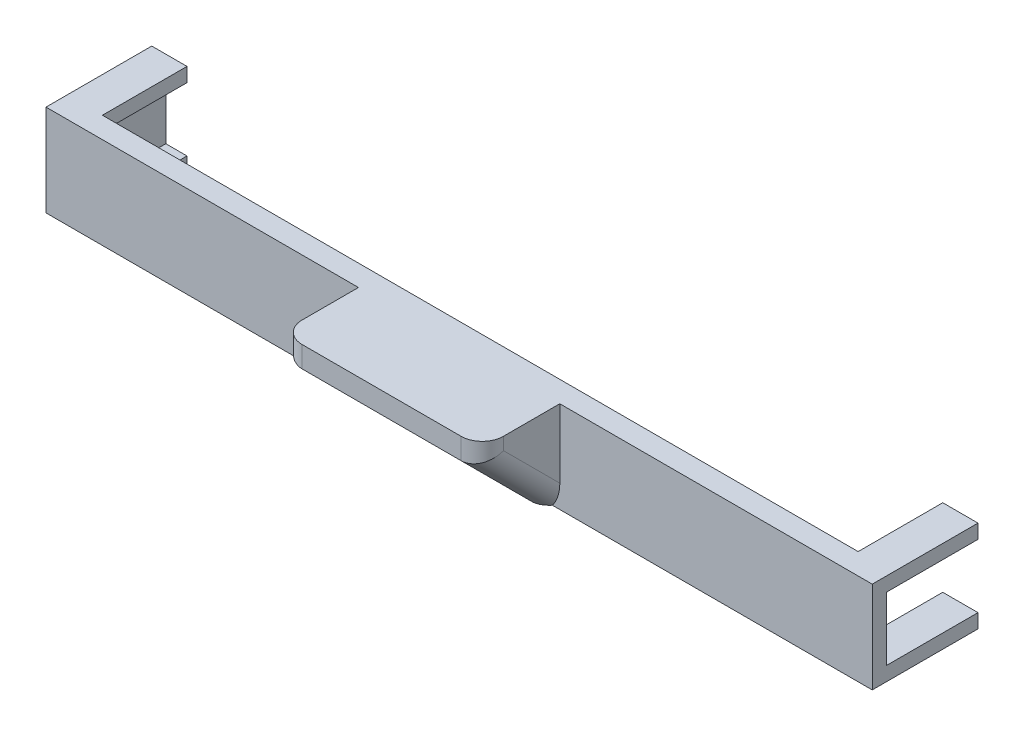
ISO-10303-21;
HEADER;
FILE_DESCRIPTION(('STEP AP214'),'2;1');
FILE_NAME('part.step','',(''),(''),'','','');
FILE_SCHEMA(('AUTOMOTIVE_DESIGN { 1 0 10303 214 1 1 1 1 }'));
ENDSEC;
DATA;
#1=APPLICATION_CONTEXT('core data for automotive mechanical design processes');
#2=APPLICATION_PROTOCOL_DEFINITION('international standard','automotive_design',2000,#1);
#3=PRODUCT_CONTEXT('',#1,'mechanical');
#4=PRODUCT('Part','Part','',(#3));
#5=PRODUCT_RELATED_PRODUCT_CATEGORY('part','',(#4));
#6=PRODUCT_DEFINITION_FORMATION('','',#4);
#7=PRODUCT_DEFINITION_CONTEXT('part definition',#1,'design');
#8=PRODUCT_DEFINITION('design','',#6,#7);
#9=PRODUCT_DEFINITION_SHAPE('','',#8);
#10=(LENGTH_UNIT() NAMED_UNIT(*) SI_UNIT(.MILLI.,.METRE.));
#11=(NAMED_UNIT(*) PLANE_ANGLE_UNIT() SI_UNIT($,.RADIAN.));
#12=(NAMED_UNIT(*) SI_UNIT($,.STERADIAN.) SOLID_ANGLE_UNIT());
#13=UNCERTAINTY_MEASURE_WITH_UNIT(LENGTH_MEASURE(1.E-05),#10,'distance_accuracy_value','');
#14=(GEOMETRIC_REPRESENTATION_CONTEXT(3) GLOBAL_UNCERTAINTY_ASSIGNED_CONTEXT((#13)) GLOBAL_UNIT_ASSIGNED_CONTEXT((#10,
#11,#12)) REPRESENTATION_CONTEXT('',''));
#15=CARTESIAN_POINT('',(0.,0.,0.));
#16=DIRECTION('',(0.,0.,1.));
#17=DIRECTION('',(1.,0.,0.));
#18=AXIS2_PLACEMENT_3D('',#15,#16,#17);
#19=CARTESIAN_POINT('',(0.,0.,15.));
#20=DIRECTION('',(0.,0.,1.));
#21=DIRECTION('',(1.,0.,0.));
#22=AXIS2_PLACEMENT_3D('',#19,#20,#21);
#23=PLANE('',#22);
#24=DIRECTION('',(0.,-1.,0.));
#25=VECTOR('',#24,1.);
#26=CARTESIAN_POINT('',(-26.3344427299537,-24.497494349856,15.));
#27=LINE('',#26,#25);
#28=CARTESIAN_POINT('',(-26.3344427299537,-24.497494349856,15.));
#29=VERTEX_POINT('',#28);
#30=CARTESIAN_POINT('',(-26.3344427299537,-34.2548536627366,15.));
#31=VERTEX_POINT('',#30);
#32=EDGE_CURVE('E204',#29,#31,#27,.T.);
#33=ORIENTED_EDGE('',*,*,#32,.F.);
#34=DIRECTION('',(-1.,0.,0.));
#35=VECTOR('',#34,1.);
#36=CARTESIAN_POINT('',(-70.6544427299537,-24.497494349856,15.));
#37=LINE('',#36,#35);
#38=CARTESIAN_POINT('',(-70.6544427299537,-24.497494349856,15.));
#39=VERTEX_POINT('',#38);
#40=EDGE_CURVE('E221',#29,#39,#37,.T.);
#41=ORIENTED_EDGE('',*,*,#40,.T.);
#42=DIRECTION('',(0.,-1.,0.));
#43=VECTOR('',#42,1.);
#44=CARTESIAN_POINT('',(-70.6544427299537,-24.497494349856,15.));
#45=LINE('',#44,#43);
#46=CARTESIAN_POINT('',(-70.6544427299537,-37.497494349856,15.));
#47=VERTEX_POINT('',#46);
#48=EDGE_CURVE('E251',#39,#47,#45,.T.);
#49=ORIENTED_EDGE('',*,*,#48,.T.);
#50=DIRECTION('',(1.,0.,0.));
#51=VECTOR('',#50,1.);
#52=CARTESIAN_POINT('',(-70.6544427299537,-37.497494349856,15.));
#53=LINE('',#52,#51);
#54=CARTESIAN_POINT('',(-25.2690333034651,-37.497494349856,15.));
#55=VERTEX_POINT('',#54);
#56=EDGE_CURVE('E262',#47,#55,#53,.T.);
#57=ORIENTED_EDGE('',*,*,#56,.T.);
#58=CARTESIAN_POINT('',(-23.3344427299537,-34.2548536627367,15.));
#59=DIRECTION('',(0.,0.,1.));
#60=DIRECTION('',(0.,-1.,0.));
#61=AXIS2_PLACEMENT_3D('',#58,#59,#60);
#62=ELLIPSE('',#61,4.24264068711928,3.);
#63=EDGE_CURVE('E372',#55,#31,#62,.F.);
#64=ORIENTED_EDGE('',*,*,#63,.T.);
#65=EDGE_LOOP('',(#33,#41,#49,#57,#64));
#66=FACE_BOUND('',#65,.T.);
#67=ADVANCED_FACE('F33',(#66),#23,.T.);
#68=CARTESIAN_POINT('',(0.,0.,0.));
#69=DIRECTION('',(0.,0.,1.));
#70=DIRECTION('',(1.,0.,0.));
#71=AXIS2_PLACEMENT_3D('',#68,#69,#70);
#72=PLANE('',#71);
#73=DIRECTION('',(1.,0.,0.));
#74=VECTOR('',#73,1.);
#75=CARTESIAN_POINT('',(-68.6544427299537,-35.497494349856,0.));
#76=LINE('',#75,#74);
#77=CARTESIAN_POINT('',(41.5455572700463,-35.497494349856,0.));
#78=VERTEX_POINT('',#77);
#79=CARTESIAN_POINT('',(46.5455572700463,-35.497494349856,0.));
#80=VERTEX_POINT('',#79);
#81=EDGE_CURVE('E279',#78,#80,#76,.T.);
#82=ORIENTED_EDGE('',*,*,#81,.T.);
#83=DIRECTION('',(0.,1.,0.));
#84=VECTOR('',#83,1.);
#85=CARTESIAN_POINT('',(46.5455572700463,-24.497494349856,0.));
#86=LINE('',#85,#84);
#87=CARTESIAN_POINT('',(46.5455572700463,-37.497494349856,0.));
#88=VERTEX_POINT('',#87);
#89=EDGE_CURVE('E245',#88,#80,#86,.T.);
#90=ORIENTED_EDGE('',*,*,#89,.F.);
#91=DIRECTION('',(1.,0.,0.));
#92=VECTOR('',#91,1.);
#93=CARTESIAN_POINT('',(-70.6544427299537,-37.497494349856,0.));
#94=LINE('',#93,#92);
#95=CARTESIAN_POINT('',(41.5455572700463,-37.497494349856,0.));
#96=VERTEX_POINT('',#95);
#97=EDGE_CURVE('E239',#96,#88,#94,.T.);
#98=ORIENTED_EDGE('',*,*,#97,.F.);
#99=DIRECTION('',(0.,-1.,0.));
#100=VECTOR('',#99,1.);
#101=CARTESIAN_POINT('',(41.5455572700463,-24.497494349856,0.));
#102=LINE('',#101,#100);
#103=EDGE_CURVE('E304',#78,#96,#102,.T.);
#104=ORIENTED_EDGE('',*,*,#103,.F.);
#105=EDGE_LOOP('',(#82,#90,#98,#104));
#106=FACE_BOUND('',#105,.T.);
#107=ADVANCED_FACE('F424',(#106),#72,.F.);
#108=DIRECTION('',(-1.,0.,0.));
#109=VECTOR('',#108,1.);
#110=CARTESIAN_POINT('',(-70.6544427299537,-24.497494349856,0.));
#111=LINE('',#110,#109);
#112=CARTESIAN_POINT('',(-65.6544427299537,-24.497494349856,0.));
#113=VERTEX_POINT('',#112);
#114=CARTESIAN_POINT('',(-70.6544427299537,-24.497494349856,0.));
#115=VERTEX_POINT('',#114);
#116=EDGE_CURVE('E248',#113,#115,#111,.T.);
#117=ORIENTED_EDGE('',*,*,#116,.F.);
#118=DIRECTION('',(0.,-1.,0.));
#119=VECTOR('',#118,1.);
#120=CARTESIAN_POINT('',(-65.6544427299537,-24.497494349856,0.));
#121=LINE('',#120,#119);
#122=CARTESIAN_POINT('',(-65.6544427299537,-26.497494349856,0.));
#123=VERTEX_POINT('',#122);
#124=EDGE_CURVE('E301',#113,#123,#121,.T.);
#125=ORIENTED_EDGE('',*,*,#124,.T.);
#126=DIRECTION('',(-1.,0.,0.));
#127=VECTOR('',#126,1.);
#128=CARTESIAN_POINT('',(-68.6544427299537,-26.497494349856,0.));
#129=LINE('',#128,#127);
#130=CARTESIAN_POINT('',(-68.6544427299537,-26.497494349856,0.));
#131=VERTEX_POINT('',#130);
#132=EDGE_CURVE('E275',#123,#131,#129,.T.);
#133=ORIENTED_EDGE('',*,*,#132,.T.);
#134=DIRECTION('',(0.,-1.,0.));
#135=VECTOR('',#134,1.);
#136=CARTESIAN_POINT('',(-68.6544427299537,-26.497494349856,0.));
#137=LINE('',#136,#135);
#138=CARTESIAN_POINT('',(-68.6544427299537,-35.497494349856,0.));
#139=VERTEX_POINT('',#138);
#140=EDGE_CURVE('E280',#131,#139,#137,.T.);
#141=ORIENTED_EDGE('',*,*,#140,.T.);
#142=CARTESIAN_POINT('',(-65.6544427299537,-35.497494349856,0.));
#143=VERTEX_POINT('',#142);
#144=EDGE_CURVE('E276',#139,#143,#76,.T.);
#145=ORIENTED_EDGE('',*,*,#144,.T.);
#146=CARTESIAN_POINT('',(-65.6544427299537,-37.497494349856,0.));
#147=VERTEX_POINT('',#146);
#148=EDGE_CURVE('E305',#143,#147,#121,.T.);
#149=ORIENTED_EDGE('',*,*,#148,.T.);
#150=CARTESIAN_POINT('',(-70.6544427299537,-37.497494349856,0.));
#151=VERTEX_POINT('',#150);
#152=EDGE_CURVE('E241',#151,#147,#94,.T.);
#153=ORIENTED_EDGE('',*,*,#152,.F.);
#154=DIRECTION('',(0.,-1.,0.));
#155=VECTOR('',#154,1.);
#156=CARTESIAN_POINT('',(-70.6544427299537,-24.497494349856,0.));
#157=LINE('',#156,#155);
#158=EDGE_CURVE('E235',#115,#151,#157,.T.);
#159=ORIENTED_EDGE('',*,*,#158,.F.);
#160=EDGE_LOOP('',(#117,#125,#133,#141,#145,#149,#153,#159));
#161=FACE_BOUND('',#160,.T.);
#162=ADVANCED_FACE('F431',(#161),#72,.F.);
#163=CARTESIAN_POINT('',(-68.6544427299537,-26.497494349856,15.));
#164=DIRECTION('',(1.,0.,0.));
#165=DIRECTION('',(0.,0.,-1.));
#166=AXIS2_PLACEMENT_3D('',#163,#164,#165);
#167=PLANE('',#166);
#168=DIRECTION('',(0.,0.,-1.));
#169=VECTOR('',#168,1.);
#170=CARTESIAN_POINT('',(-68.6544427299537,-26.497494349856,15.));
#171=LINE('',#170,#169);
#172=CARTESIAN_POINT('',(-68.6544427299537,-26.497494349856,13.));
#173=VERTEX_POINT('',#172);
#174=EDGE_CURVE('E269',#173,#131,#171,.T.);
#175=ORIENTED_EDGE('',*,*,#174,.F.);
#176=DIRECTION('',(0.,-1.,0.));
#177=VECTOR('',#176,1.);
#178=CARTESIAN_POINT('',(-68.6544427299537,-26.497494349856,13.));
#179=LINE('',#178,#177);
#180=CARTESIAN_POINT('',(-68.6544427299537,-35.497494349856,13.));
#181=VERTEX_POINT('',#180);
#182=EDGE_CURVE('E283',#173,#181,#179,.T.);
#183=ORIENTED_EDGE('',*,*,#182,.T.);
#184=DIRECTION('',(0.,0.,-1.));
#185=VECTOR('',#184,1.);
#186=CARTESIAN_POINT('',(-68.6544427299537,-35.497494349856,15.));
#187=LINE('',#186,#185);
#188=EDGE_CURVE('E240',#181,#139,#187,.T.);
#189=ORIENTED_EDGE('',*,*,#188,.T.);
#190=ORIENTED_EDGE('',*,*,#140,.F.);
#191=EDGE_LOOP('',(#175,#183,#189,#190));
#192=FACE_BOUND('',#191,.T.);
#193=ADVANCED_FACE('F451',(#192),#167,.T.);
#194=CARTESIAN_POINT('',(-68.6544427299537,-35.497494349856,15.));
#195=DIRECTION('',(0.,1.,0.));
#196=DIRECTION('',(0.,0.,1.));
#197=AXIS2_PLACEMENT_3D('',#194,#195,#196);
#198=PLANE('',#197);
#199=DIRECTION('',(0.,0.,1.));
#200=VECTOR('',#199,1.);
#201=CARTESIAN_POINT('',(-65.6544427299537,-35.497494349856,15.));
#202=LINE('',#201,#200);
#203=CARTESIAN_POINT('',(-65.6544427299537,-35.497494349856,12.));
#204=VERTEX_POINT('',#203);
#205=EDGE_CURVE('E288',#143,#204,#202,.T.);
#206=ORIENTED_EDGE('',*,*,#205,.F.);
#207=ORIENTED_EDGE('',*,*,#144,.F.);
#208=ORIENTED_EDGE('',*,*,#188,.F.);
#209=DIRECTION('',(1.,0.,0.));
#210=VECTOR('',#209,1.);
#211=CARTESIAN_POINT('',(-68.6544427299537,-35.497494349856,13.));
#212=LINE('',#211,#210);
#213=CARTESIAN_POINT('',(46.5455572700463,-35.497494349856,13.));
#214=VERTEX_POINT('',#213);
#215=EDGE_CURVE('E286',#181,#214,#212,.T.);
#216=ORIENTED_EDGE('',*,*,#215,.T.);
#217=DIRECTION('',(0.,0.,-1.));
#218=VECTOR('',#217,1.);
#219=CARTESIAN_POINT('',(46.5455572700463,-35.497494349856,0.));
#220=LINE('',#219,#218);
#221=EDGE_CURVE('E324',#214,#80,#220,.T.);
#222=ORIENTED_EDGE('',*,*,#221,.T.);
#223=ORIENTED_EDGE('',*,*,#81,.F.);
#224=DIRECTION('',(0.,0.,-1.));
#225=VECTOR('',#224,1.);
#226=CARTESIAN_POINT('',(41.5455572700463,-35.497494349856,15.));
#227=LINE('',#226,#225);
#228=CARTESIAN_POINT('',(41.5455572700463,-35.497494349856,12.));
#229=VERTEX_POINT('',#228);
#230=EDGE_CURVE('E296',#229,#78,#227,.T.);
#231=ORIENTED_EDGE('',*,*,#230,.F.);
#232=DIRECTION('',(1.,0.,0.));
#233=VECTOR('',#232,1.);
#234=CARTESIAN_POINT('',(-68.6544427299537,-35.497494349856,12.));
#235=LINE('',#234,#233);
#236=EDGE_CURVE('E292',#204,#229,#235,.T.);
#237=ORIENTED_EDGE('',*,*,#236,.F.);
#238=EDGE_LOOP('',(#206,#207,#208,#216,#222,#223,#231,#237));
#239=FACE_BOUND('',#238,.T.);
#240=ADVANCED_FACE('F445',(#239),#198,.T.);
#241=CARTESIAN_POINT('',(-68.6544427299537,-26.497494349856,15.));
#242=DIRECTION('',(0.,-1.,0.));
#243=DIRECTION('',(0.,0.,-1.));
#244=AXIS2_PLACEMENT_3D('',#241,#242,#243);
#245=PLANE('',#244);
#246=DIRECTION('',(0.,0.,-1.));
#247=VECTOR('',#246,1.);
#248=CARTESIAN_POINT('',(-65.6544427299537,-26.497494349856,15.));
#249=LINE('',#248,#247);
#250=CARTESIAN_POINT('',(-65.6544427299537,-26.497494349856,12.));
#251=VERTEX_POINT('',#250);
#252=EDGE_CURVE('E290',#251,#123,#249,.T.);
#253=ORIENTED_EDGE('',*,*,#252,.F.);
#254=DIRECTION('',(-1.,0.,0.));
#255=VECTOR('',#254,1.);
#256=CARTESIAN_POINT('',(-68.6544427299537,-26.497494349856,12.));
#257=LINE('',#256,#255);
#258=CARTESIAN_POINT('',(41.5455572700463,-26.497494349856,12.));
#259=VERTEX_POINT('',#258);
#260=EDGE_CURVE('E294',#259,#251,#257,.T.);
#261=ORIENTED_EDGE('',*,*,#260,.F.);
#262=DIRECTION('',(0.,0.,1.));
#263=VECTOR('',#262,1.);
#264=CARTESIAN_POINT('',(41.5455572700463,-26.497494349856,15.));
#265=LINE('',#264,#263);
#266=CARTESIAN_POINT('',(41.5455572700463,-26.497494349856,0.));
#267=VERTEX_POINT('',#266);
#268=EDGE_CURVE('E298',#267,#259,#265,.T.);
#269=ORIENTED_EDGE('',*,*,#268,.F.);
#270=CARTESIAN_POINT('',(46.5455572700463,-26.497494349856,0.));
#271=VERTEX_POINT('',#270);
#272=EDGE_CURVE('E272',#271,#267,#129,.T.);
#273=ORIENTED_EDGE('',*,*,#272,.F.);
#274=DIRECTION('',(0.,0.,1.));
#275=VECTOR('',#274,1.);
#276=CARTESIAN_POINT('',(46.5455572700463,-26.497494349856,0.));
#277=LINE('',#276,#275);
#278=CARTESIAN_POINT('',(46.5455572700463,-26.497494349856,13.));
#279=VERTEX_POINT('',#278);
#280=EDGE_CURVE('E213',#271,#279,#277,.T.);
#281=ORIENTED_EDGE('',*,*,#280,.T.);
#282=DIRECTION('',(-1.,0.,0.));
#283=VECTOR('',#282,1.);
#284=CARTESIAN_POINT('',(-68.6544427299537,-26.497494349856,13.));
#285=LINE('',#284,#283);
#286=EDGE_CURVE('E259',#279,#173,#285,.T.);
#287=ORIENTED_EDGE('',*,*,#286,.T.);
#288=ORIENTED_EDGE('',*,*,#174,.T.);
#289=ORIENTED_EDGE('',*,*,#132,.F.);
#290=EDGE_LOOP('',(#253,#261,#269,#273,#281,#287,#288,#289));
#291=FACE_BOUND('',#290,.T.);
#292=ADVANCED_FACE('F437',(#291),#245,.T.);
#293=DIRECTION('',(0.,1.,0.));
#294=VECTOR('',#293,1.);
#295=CARTESIAN_POINT('',(2.22555727004627,-24.497494349856,15.));
#296=LINE('',#295,#294);
#297=CARTESIAN_POINT('',(2.22555727004627,-34.2548536627367,15.));
#298=VERTEX_POINT('',#297);
#299=CARTESIAN_POINT('',(2.22555727004627,-24.497494349856,15.));
#300=VERTEX_POINT('',#299);
#301=EDGE_CURVE('E193',#298,#300,#296,.T.);
#302=ORIENTED_EDGE('',*,*,#301,.F.);
#303=CARTESIAN_POINT('',(-0.774442729953734,-34.2548536627367,15.));
#304=DIRECTION('',(0.,0.,1.));
#305=DIRECTION('',(0.,1.,0.));
#306=AXIS2_PLACEMENT_3D('',#303,#304,#305);
#307=ELLIPSE('',#306,4.24264068711928,3.);
#308=CARTESIAN_POINT('',(1.16014784355765,-37.497494349856,15.));
#309=VERTEX_POINT('',#308);
#310=EDGE_CURVE('E11',#298,#309,#307,.F.);
#311=ORIENTED_EDGE('',*,*,#310,.T.);
#312=CARTESIAN_POINT('',(46.5455572700463,-37.497494349856,15.));
#313=VERTEX_POINT('',#312);
#314=EDGE_CURVE('E49',#309,#313,#53,.T.);
#315=ORIENTED_EDGE('',*,*,#314,.T.);
#316=DIRECTION('',(0.,1.,0.));
#317=VECTOR('',#316,1.);
#318=CARTESIAN_POINT('',(46.5455572700463,-24.497494349856,15.));
#319=LINE('',#318,#317);
#320=CARTESIAN_POINT('',(46.5455572700463,-24.497494349856,15.));
#321=VERTEX_POINT('',#320);
#322=EDGE_CURVE('E218',#313,#321,#319,.T.);
#323=ORIENTED_EDGE('',*,*,#322,.T.);
#324=EDGE_CURVE('E211',#321,#300,#37,.T.);
#325=ORIENTED_EDGE('',*,*,#324,.T.);
#326=EDGE_LOOP('',(#302,#311,#315,#323,#325));
#327=FACE_BOUND('',#326,.T.);
#328=ADVANCED_FACE('F216',(#327),#23,.T.);
#329=CARTESIAN_POINT('',(46.5455572700463,-24.497494349856,0.));
#330=VERTEX_POINT('',#329);
#331=EDGE_CURVE('E244',#271,#330,#86,.T.);
#332=ORIENTED_EDGE('',*,*,#331,.F.);
#333=ORIENTED_EDGE('',*,*,#272,.T.);
#334=CARTESIAN_POINT('',(41.5455572700463,-24.497494349856,0.));
#335=VERTEX_POINT('',#334);
#336=EDGE_CURVE('E306',#335,#267,#102,.T.);
#337=ORIENTED_EDGE('',*,*,#336,.F.);
#338=EDGE_CURVE('E249',#330,#335,#111,.T.);
#339=ORIENTED_EDGE('',*,*,#338,.F.);
#340=EDGE_LOOP('',(#332,#333,#337,#339));
#341=FACE_BOUND('',#340,.T.);
#342=ADVANCED_FACE('F434',(#341),#72,.F.);
#343=CARTESIAN_POINT('',(-70.6544427299537,-24.497494349856,15.));
#344=DIRECTION('',(1.,0.,0.));
#345=DIRECTION('',(0.,1.,0.));
#346=AXIS2_PLACEMENT_3D('',#343,#344,#345);
#347=PLANE('',#346);
#348=DIRECTION('',(0.,0.,-1.));
#349=VECTOR('',#348,1.);
#350=CARTESIAN_POINT('',(-70.6544427299537,-24.497494349856,15.));
#351=LINE('',#350,#349);
#352=EDGE_CURVE('E220',#39,#115,#351,.T.);
#353=ORIENTED_EDGE('',*,*,#352,.T.);
#354=ORIENTED_EDGE('',*,*,#158,.T.);
#355=DIRECTION('',(0.,0.,-1.));
#356=VECTOR('',#355,1.);
#357=CARTESIAN_POINT('',(-70.6544427299537,-37.497494349856,15.));
#358=LINE('',#357,#356);
#359=EDGE_CURVE('E257',#47,#151,#358,.T.);
#360=ORIENTED_EDGE('',*,*,#359,.F.);
#361=ORIENTED_EDGE('',*,*,#48,.F.);
#362=EDGE_LOOP('',(#353,#354,#360,#361));
#363=FACE_BOUND('',#362,.T.);
#364=ADVANCED_FACE('F442',(#363),#347,.F.);
#365=CARTESIAN_POINT('',(-70.6544427299537,-37.497494349856,15.));
#366=DIRECTION('',(0.,1.,0.));
#367=DIRECTION('',(0.,0.,1.));
#368=AXIS2_PLACEMENT_3D('',#365,#366,#367);
#369=PLANE('',#368);
#370=ORIENTED_EDGE('',*,*,#314,.F.);
#371=CARTESIAN_POINT('',(-0.774442729953734,-37.497494349856,11.7573593128807));
#372=DIRECTION('',(0.,1.,0.));
#373=DIRECTION('',(0.,0.,1.));
#374=AXIS2_PLACEMENT_3D('',#371,#372,#373);
#375=ELLIPSE('',#374,4.24264068711929,3.);
#376=CARTESIAN_POINT('',(-0.774442729953733,-37.497494349856,15.9999999999999));
#377=VERTEX_POINT('',#376);
#378=EDGE_CURVE('E53',#309,#377,#375,.F.);
#379=ORIENTED_EDGE('',*,*,#378,.T.);
#380=DIRECTION('',(-1.,0.,0.));
#381=VECTOR('',#380,1.);
#382=CARTESIAN_POINT('',(-26.3344427299537,-37.497494349856,15.9999999999999));
#383=LINE('',#382,#381);
#384=CARTESIAN_POINT('',(-23.3344427299537,-37.497494349856,15.9999999999999));
#385=VERTEX_POINT('',#384);
#386=EDGE_CURVE('E356',#377,#385,#383,.T.);
#387=ORIENTED_EDGE('',*,*,#386,.T.);
#388=CARTESIAN_POINT('',(-23.3344427299537,-37.497494349856,11.7573593128807));
#389=DIRECTION('',(0.,1.,0.));
#390=DIRECTION('',(0.,0.,-1.));
#391=AXIS2_PLACEMENT_3D('',#388,#389,#390);
#392=ELLIPSE('',#391,4.24264068711929,3.);
#393=EDGE_CURVE('E374',#385,#55,#392,.F.);
#394=ORIENTED_EDGE('',*,*,#393,.T.);
#395=ORIENTED_EDGE('',*,*,#56,.F.);
#396=ORIENTED_EDGE('',*,*,#359,.T.);
#397=ORIENTED_EDGE('',*,*,#152,.T.);
#398=DIRECTION('',(0.,0.,-1.));
#399=VECTOR('',#398,1.);
#400=CARTESIAN_POINT('',(-65.6544427299537,-37.497494349856,0.));
#401=LINE('',#400,#399);
#402=CARTESIAN_POINT('',(-65.6544427299537,-37.497494349856,12.));
#403=VERTEX_POINT('',#402);
#404=EDGE_CURVE('E322',#403,#147,#401,.T.);
#405=ORIENTED_EDGE('',*,*,#404,.F.);
#406=DIRECTION('',(-1.,0.,0.));
#407=VECTOR('',#406,1.);
#408=CARTESIAN_POINT('',(-65.6544427299537,-37.497494349856,12.));
#409=LINE('',#408,#407);
#410=CARTESIAN_POINT('',(41.5455572700463,-37.497494349856,12.));
#411=VERTEX_POINT('',#410);
#412=EDGE_CURVE('E315',#411,#403,#409,.T.);
#413=ORIENTED_EDGE('',*,*,#412,.F.);
#414=DIRECTION('',(0.,0.,1.));
#415=VECTOR('',#414,1.);
#416=CARTESIAN_POINT('',(41.5455572700463,-37.497494349856,0.));
#417=LINE('',#416,#415);
#418=EDGE_CURVE('E319',#96,#411,#417,.T.);
#419=ORIENTED_EDGE('',*,*,#418,.F.);
#420=ORIENTED_EDGE('',*,*,#97,.T.);
#421=DIRECTION('',(0.,0.,-1.));
#422=VECTOR('',#421,1.);
#423=CARTESIAN_POINT('',(46.5455572700463,-37.497494349856,15.));
#424=LINE('',#423,#422);
#425=EDGE_CURVE('E254',#313,#88,#424,.T.);
#426=ORIENTED_EDGE('',*,*,#425,.F.);
#427=EDGE_LOOP('',(#370,#379,#387,#394,#395,#396,#397,#405,#413,#419,#420,#426));
#428=FACE_BOUND('',#427,.T.);
#429=ADVANCED_FACE('F398',(#428),#369,.F.);
#430=CARTESIAN_POINT('',(46.5455572700463,-24.497494349856,15.));
#431=DIRECTION('',(-1.,0.,0.));
#432=DIRECTION('',(0.,0.,1.));
#433=AXIS2_PLACEMENT_3D('',#430,#431,#432);
#434=PLANE('',#433);
#435=ORIENTED_EDGE('',*,*,#89,.T.);
#436=ORIENTED_EDGE('',*,*,#221,.F.);
#437=DIRECTION('',(0.,-1.,0.));
#438=VECTOR('',#437,1.);
#439=CARTESIAN_POINT('',(46.5455572700463,-35.497494349856,13.));
#440=LINE('',#439,#438);
#441=EDGE_CURVE('E335',#279,#214,#440,.T.);
#442=ORIENTED_EDGE('',*,*,#441,.F.);
#443=ORIENTED_EDGE('',*,*,#280,.F.);
#444=ORIENTED_EDGE('',*,*,#331,.T.);
#445=DIRECTION('',(0.,0.,-1.));
#446=VECTOR('',#445,1.);
#447=CARTESIAN_POINT('',(46.5455572700463,-24.497494349856,15.));
#448=LINE('',#447,#446);
#449=EDGE_CURVE('E224',#321,#330,#448,.T.);
#450=ORIENTED_EDGE('',*,*,#449,.F.);
#451=ORIENTED_EDGE('',*,*,#322,.F.);
#452=ORIENTED_EDGE('',*,*,#425,.T.);
#453=EDGE_LOOP('',(#435,#436,#442,#443,#444,#450,#451,#452));
#454=FACE_BOUND('',#453,.T.);
#455=ADVANCED_FACE('F493',(#454),#434,.F.);
#456=CARTESIAN_POINT('',(-70.6544427299537,-24.497494349856,15.));
#457=DIRECTION('',(0.,-1.,0.));
#458=DIRECTION('',(0.,0.,-1.));
#459=AXIS2_PLACEMENT_3D('',#456,#457,#458);
#460=PLANE('',#459);
#461=DIRECTION('',(-1.,0.,0.));
#462=VECTOR('',#461,1.);
#463=CARTESIAN_POINT('',(-26.3344427299537,-24.497494349856,26.));
#464=LINE('',#463,#462);
#465=CARTESIAN_POINT('',(-0.774442729953733,-24.497494349856,26.));
#466=VERTEX_POINT('',#465);
#467=CARTESIAN_POINT('',(-23.3344427299537,-24.497494349856,26.));
#468=VERTEX_POINT('',#467);
#469=EDGE_CURVE('E203',#466,#468,#464,.T.);
#470=ORIENTED_EDGE('',*,*,#469,.F.);
#471=CARTESIAN_POINT('',(-0.774442729953734,-24.497494349856,23.));
#472=DIRECTION('',(0.,-1.,0.));
#473=DIRECTION('',(0.,0.,-1.));
#474=AXIS2_PLACEMENT_3D('',#471,#472,#473);
#475=CIRCLE('',#474,3.);
#476=CARTESIAN_POINT('',(2.22555727004627,-24.497494349856,23.));
#477=VERTEX_POINT('',#476);
#478=EDGE_CURVE('E212',#466,#477,#475,.F.);
#479=ORIENTED_EDGE('',*,*,#478,.T.);
#480=DIRECTION('',(0.,0.,-1.));
#481=VECTOR('',#480,1.);
#482=CARTESIAN_POINT('',(2.22555727004627,-24.497494349856,26.));
#483=LINE('',#482,#481);
#484=EDGE_CURVE('E196',#477,#300,#483,.T.);
#485=ORIENTED_EDGE('',*,*,#484,.T.);
#486=ORIENTED_EDGE('',*,*,#324,.F.);
#487=ORIENTED_EDGE('',*,*,#449,.T.);
#488=ORIENTED_EDGE('',*,*,#338,.T.);
#489=DIRECTION('',(0.,0.,1.));
#490=VECTOR('',#489,1.);
#491=CARTESIAN_POINT('',(41.5455572700463,-24.497494349856,0.));
#492=LINE('',#491,#490);
#493=CARTESIAN_POINT('',(41.5455572700463,-24.497494349856,12.));
#494=VERTEX_POINT('',#493);
#495=EDGE_CURVE('E328',#335,#494,#492,.T.);
#496=ORIENTED_EDGE('',*,*,#495,.T.);
#497=DIRECTION('',(-1.,0.,0.));
#498=VECTOR('',#497,1.);
#499=CARTESIAN_POINT('',(-65.6544427299537,-24.497494349856,12.));
#500=LINE('',#499,#498);
#501=CARTESIAN_POINT('',(-65.6544427299537,-24.497494349856,12.));
#502=VERTEX_POINT('',#501);
#503=EDGE_CURVE('E325',#494,#502,#500,.T.);
#504=ORIENTED_EDGE('',*,*,#503,.T.);
#505=DIRECTION('',(0.,0.,-1.));
#506=VECTOR('',#505,1.);
#507=CARTESIAN_POINT('',(-65.6544427299537,-24.497494349856,0.));
#508=LINE('',#507,#506);
#509=EDGE_CURVE('E318',#502,#113,#508,.T.);
#510=ORIENTED_EDGE('',*,*,#509,.T.);
#511=ORIENTED_EDGE('',*,*,#116,.T.);
#512=ORIENTED_EDGE('',*,*,#352,.F.);
#513=ORIENTED_EDGE('',*,*,#40,.F.);
#514=DIRECTION('',(0.,0.,-1.));
#515=VECTOR('',#514,1.);
#516=CARTESIAN_POINT('',(-26.3344427299537,-24.497494349856,26.));
#517=LINE('',#516,#515);
#518=CARTESIAN_POINT('',(-26.3344427299537,-24.497494349856,23.));
#519=VERTEX_POINT('',#518);
#520=EDGE_CURVE('E214',#519,#29,#517,.T.);
#521=ORIENTED_EDGE('',*,*,#520,.F.);
#522=CARTESIAN_POINT('',(-23.3344427299537,-24.497494349856,23.));
#523=DIRECTION('',(0.,-1.,0.));
#524=DIRECTION('',(0.,0.,-1.));
#525=AXIS2_PLACEMENT_3D('',#522,#523,#524);
#526=CIRCLE('',#525,3.);
#527=EDGE_CURVE('E390',#519,#468,#526,.F.);
#528=ORIENTED_EDGE('',*,*,#527,.T.);
#529=EDGE_LOOP('',(#470,#479,#485,#486,#487,#488,#496,#504,#510,#511,#512,#513,#521,#528));
#530=FACE_BOUND('',#529,.T.);
#531=ADVANCED_FACE('F209',(#530),#460,.F.);
#532=CARTESIAN_POINT('',(0.,0.,13.));
#533=DIRECTION('',(0.,0.,1.));
#534=DIRECTION('',(1.,0.,0.));
#535=AXIS2_PLACEMENT_3D('',#532,#533,#534);
#536=PLANE('',#535);
#537=ORIENTED_EDGE('',*,*,#182,.F.);
#538=ORIENTED_EDGE('',*,*,#286,.F.);
#539=ORIENTED_EDGE('',*,*,#441,.T.);
#540=ORIENTED_EDGE('',*,*,#215,.F.);
#541=EDGE_LOOP('',(#537,#538,#539,#540));
#542=FACE_BOUND('',#541,.T.);
#543=ADVANCED_FACE('F456',(#542),#536,.F.);
#544=CARTESIAN_POINT('',(41.5455572700463,-24.497494349856,0.));
#545=DIRECTION('',(1.,0.,0.));
#546=DIRECTION('',(0.,0.,-1.));
#547=AXIS2_PLACEMENT_3D('',#544,#545,#546);
#548=PLANE('',#547);
#549=ORIENTED_EDGE('',*,*,#268,.T.);
#550=DIRECTION('',(0.,-1.,0.));
#551=VECTOR('',#550,1.);
#552=CARTESIAN_POINT('',(41.5455572700463,-24.497494349856,12.));
#553=LINE('',#552,#551);
#554=EDGE_CURVE('E309',#494,#259,#553,.T.);
#555=ORIENTED_EDGE('',*,*,#554,.F.);
#556=ORIENTED_EDGE('',*,*,#495,.F.);
#557=ORIENTED_EDGE('',*,*,#336,.T.);
#558=EDGE_LOOP('',(#549,#555,#556,#557));
#559=FACE_BOUND('',#558,.T.);
#560=ADVANCED_FACE('F487',(#559),#548,.F.);
#561=CARTESIAN_POINT('',(-65.6544427299537,-24.497494349856,12.));
#562=DIRECTION('',(0.,0.,1.));
#563=DIRECTION('',(1.,0.,0.));
#564=AXIS2_PLACEMENT_3D('',#561,#562,#563);
#565=PLANE('',#564);
#566=ORIENTED_EDGE('',*,*,#260,.T.);
#567=DIRECTION('',(0.,-1.,0.));
#568=VECTOR('',#567,1.);
#569=CARTESIAN_POINT('',(-65.6544427299537,-24.497494349856,12.));
#570=LINE('',#569,#568);
#571=EDGE_CURVE('E300',#502,#251,#570,.T.);
#572=ORIENTED_EDGE('',*,*,#571,.F.);
#573=ORIENTED_EDGE('',*,*,#503,.F.);
#574=ORIENTED_EDGE('',*,*,#554,.T.);
#575=EDGE_LOOP('',(#566,#572,#573,#574));
#576=FACE_BOUND('',#575,.T.);
#577=ADVANCED_FACE('F484',(#576),#565,.F.);
#578=CARTESIAN_POINT('',(-65.6544427299537,-24.497494349856,0.));
#579=DIRECTION('',(-1.,0.,0.));
#580=DIRECTION('',(0.,0.,1.));
#581=AXIS2_PLACEMENT_3D('',#578,#579,#580);
#582=PLANE('',#581);
#583=ORIENTED_EDGE('',*,*,#252,.T.);
#584=ORIENTED_EDGE('',*,*,#124,.F.);
#585=ORIENTED_EDGE('',*,*,#509,.F.);
#586=ORIENTED_EDGE('',*,*,#571,.T.);
#587=EDGE_LOOP('',(#583,#584,#585,#586));
#588=FACE_BOUND('',#587,.T.);
#589=ADVANCED_FACE('F481',(#588),#582,.F.);
#590=ORIENTED_EDGE('',*,*,#205,.T.);
#591=EDGE_CURVE('E312',#204,#403,#570,.T.);
#592=ORIENTED_EDGE('',*,*,#591,.T.);
#593=ORIENTED_EDGE('',*,*,#404,.T.);
#594=ORIENTED_EDGE('',*,*,#148,.F.);
#595=EDGE_LOOP('',(#590,#592,#593,#594));
#596=FACE_BOUND('',#595,.T.);
#597=ADVANCED_FACE('F508',(#596),#582,.F.);
#598=ORIENTED_EDGE('',*,*,#236,.T.);
#599=EDGE_CURVE('E308',#229,#411,#553,.T.);
#600=ORIENTED_EDGE('',*,*,#599,.T.);
#601=ORIENTED_EDGE('',*,*,#412,.T.);
#602=ORIENTED_EDGE('',*,*,#591,.F.);
#603=EDGE_LOOP('',(#598,#600,#601,#602));
#604=FACE_BOUND('',#603,.T.);
#605=ADVANCED_FACE('F504',(#604),#565,.F.);
#606=ORIENTED_EDGE('',*,*,#230,.T.);
#607=ORIENTED_EDGE('',*,*,#103,.T.);
#608=ORIENTED_EDGE('',*,*,#418,.T.);
#609=ORIENTED_EDGE('',*,*,#599,.F.);
#610=EDGE_LOOP('',(#606,#607,#608,#609));
#611=FACE_BOUND('',#610,.T.);
#612=ADVANCED_FACE('F500',(#611),#548,.F.);
#613=CARTESIAN_POINT('',(-26.3344427299537,-24.497494349856,26.));
#614=DIRECTION('',(1.,0.,0.));
#615=DIRECTION('',(0.,0.,-1.));
#616=AXIS2_PLACEMENT_3D('',#613,#614,#615);
#617=PLANE('',#616);
#618=DIRECTION('',(0.,0.707106781186546,0.707106781186549));
#619=VECTOR('',#618,1.);
#620=CARTESIAN_POINT('',(-26.3344427299537,-25.3761740062963,23.8786796564404));
#621=LINE('',#620,#619);
#622=CARTESIAN_POINT('',(-26.3344427299537,-26.2548536627367,23.));
#623=VERTEX_POINT('',#622);
#624=EDGE_CURVE('E386',#31,#623,#621,.T.);
#625=ORIENTED_EDGE('',*,*,#624,.T.);
#626=DIRECTION('',(0.,-1.,0.));
#627=VECTOR('',#626,1.);
#628=CARTESIAN_POINT('',(-26.3344427299537,-24.497494349856,23.));
#629=LINE('',#628,#627);
#630=EDGE_CURVE('E388',#623,#519,#629,.F.);
#631=ORIENTED_EDGE('',*,*,#630,.T.);
#632=ORIENTED_EDGE('',*,*,#520,.T.);
#633=ORIENTED_EDGE('',*,*,#32,.T.);
#634=EDGE_LOOP('',(#625,#631,#632,#633));
#635=FACE_BOUND('',#634,.T.);
#636=ADVANCED_FACE('F408',(#635),#617,.F.);
#637=CARTESIAN_POINT('',(2.22555727004627,-24.497494349856,26.));
#638=DIRECTION('',(-1.,0.,0.));
#639=DIRECTION('',(0.,0.,1.));
#640=AXIS2_PLACEMENT_3D('',#637,#638,#639);
#641=PLANE('',#640);
#642=ORIENTED_EDGE('',*,*,#484,.F.);
#643=DIRECTION('',(0.,1.,0.));
#644=VECTOR('',#643,1.);
#645=CARTESIAN_POINT('',(2.22555727004627,-27.497494349856,23.));
#646=LINE('',#645,#644);
#647=CARTESIAN_POINT('',(2.22555727004627,-26.2548536627367,23.));
#648=VERTEX_POINT('',#647);
#649=EDGE_CURVE('E347',#477,#648,#646,.F.);
#650=ORIENTED_EDGE('',*,*,#649,.T.);
#651=DIRECTION('',(0.,-0.707106781186546,-0.707106781186549));
#652=VECTOR('',#651,1.);
#653=CARTESIAN_POINT('',(2.22555727004627,-35.3761740062963,13.8786796564403));
#654=LINE('',#653,#652);
#655=EDGE_CURVE('E199',#648,#298,#654,.T.);
#656=ORIENTED_EDGE('',*,*,#655,.T.);
#657=ORIENTED_EDGE('',*,*,#301,.T.);
#658=EDGE_LOOP('',(#642,#650,#656,#657));
#659=FACE_BOUND('',#658,.T.);
#660=ADVANCED_FACE('F195',(#659),#641,.F.);
#661=CARTESIAN_POINT('',(0.,0.,26.));
#662=DIRECTION('',(0.,0.,1.));
#663=DIRECTION('',(1.,0.,0.));
#664=AXIS2_PLACEMENT_3D('',#661,#662,#663);
#665=PLANE('',#664);
#666=DIRECTION('',(1.,0.,0.));
#667=VECTOR('',#666,1.);
#668=CARTESIAN_POINT('',(2.22555727004627,-27.497494349856,26.));
#669=LINE('',#668,#667);
#670=CARTESIAN_POINT('',(-23.3344427299537,-27.497494349856,26.));
#671=VERTEX_POINT('',#670);
#672=CARTESIAN_POINT('',(-0.774442729953734,-27.497494349856,26.));
#673=VERTEX_POINT('',#672);
#674=EDGE_CURVE('E261',#671,#673,#669,.T.);
#675=ORIENTED_EDGE('',*,*,#674,.T.);
#676=DIRECTION('',(0.,1.,0.));
#677=VECTOR('',#676,1.);
#678=CARTESIAN_POINT('',(-0.774442729953734,-24.497494349856,26.));
#679=LINE('',#678,#677);
#680=EDGE_CURVE('E364',#673,#466,#679,.T.);
#681=ORIENTED_EDGE('',*,*,#680,.T.);
#682=ORIENTED_EDGE('',*,*,#469,.T.);
#683=DIRECTION('',(0.,-1.,0.));
#684=VECTOR('',#683,1.);
#685=CARTESIAN_POINT('',(-23.3344427299537,-27.497494349856,26.));
#686=LINE('',#685,#684);
#687=EDGE_CURVE('E366',#468,#671,#686,.T.);
#688=ORIENTED_EDGE('',*,*,#687,.T.);
#689=EDGE_LOOP('',(#675,#681,#682,#688));
#690=FACE_BOUND('',#689,.T.);
#691=ADVANCED_FACE('F362',(#690),#665,.T.);
#692=CARTESIAN_POINT('',(0.,-27.497494349856,26.));
#693=DIRECTION('',(0.,-0.707106781186549,0.707106781186546));
#694=DIRECTION('',(-1.,0.,0.));
#695=AXIS2_PLACEMENT_3D('',#692,#693,#694);
#696=PLANE('',#695);
#697=ORIENTED_EDGE('',*,*,#386,.F.);
#698=DIRECTION('',(0.,-0.707106781186546,-0.707106781186549));
#699=VECTOR('',#698,1.);
#700=CARTESIAN_POINT('',(-0.774442729953734,-27.497494349856,26.));
#701=LINE('',#700,#699);
#702=EDGE_CURVE('E42',#377,#673,#701,.F.);
#703=ORIENTED_EDGE('',*,*,#702,.T.);
#704=ORIENTED_EDGE('',*,*,#674,.F.);
#705=DIRECTION('',(0.,0.707106781186546,0.707106781186549));
#706=VECTOR('',#705,1.);
#707=CARTESIAN_POINT('',(-23.3344427299537,-37.497494349856,15.9999999999999));
#708=LINE('',#707,#706);
#709=EDGE_CURVE('E393',#671,#385,#708,.F.);
#710=ORIENTED_EDGE('',*,*,#709,.T.);
#711=EDGE_LOOP('',(#697,#703,#704,#710));
#712=FACE_BOUND('',#711,.T.);
#713=ADVANCED_FACE('F354',(#712),#696,.T.);
#714=CARTESIAN_POINT('',(-23.3344427299537,-23.8761740062963,25.3786796564404));
#715=DIRECTION('',(0.,-0.707106781186546,-0.707106781186549));
#716=DIRECTION('',(0.,0.707106781186549,-0.707106781186546));
#717=AXIS2_PLACEMENT_3D('',#714,#715,#716);
#718=CYLINDRICAL_SURFACE('',#717,3.);
#719=ORIENTED_EDGE('',*,*,#393,.F.);
#720=ORIENTED_EDGE('',*,*,#709,.F.);
#721=CARTESIAN_POINT('',(-23.3344427299537,-26.2548536627367,23.));
#722=DIRECTION('',(0.,-0.923879532511286,-0.382683432365091));
#723=DIRECTION('',(0.,0.382683432365091,-0.923879532511286));
#724=AXIS2_PLACEMENT_3D('',#721,#722,#723);
#725=ELLIPSE('',#724,3.24717660087718,3.);
#726=EDGE_CURVE('E370',#623,#671,#725,.F.);
#727=ORIENTED_EDGE('',*,*,#726,.F.);
#728=ORIENTED_EDGE('',*,*,#624,.F.);
#729=ORIENTED_EDGE('',*,*,#63,.F.);
#730=EDGE_LOOP('',(#719,#720,#727,#728,#729));
#731=FACE_BOUND('',#730,.T.);
#732=ADVANCED_FACE('F402',(#731),#718,.T.);
#733=CARTESIAN_POINT('',(-23.3344427299537,0.,23.));
#734=DIRECTION('',(0.,1.,0.));
#735=DIRECTION('',(0.,0.,1.));
#736=AXIS2_PLACEMENT_3D('',#733,#734,#735);
#737=CYLINDRICAL_SURFACE('',#736,3.);
#738=ORIENTED_EDGE('',*,*,#527,.F.);
#739=ORIENTED_EDGE('',*,*,#630,.F.);
#740=ORIENTED_EDGE('',*,*,#726,.T.);
#741=ORIENTED_EDGE('',*,*,#687,.F.);
#742=EDGE_LOOP('',(#738,#739,#740,#741));
#743=FACE_BOUND('',#742,.T.);
#744=ADVANCED_FACE('F414',(#743),#737,.T.);
#745=CARTESIAN_POINT('',(-0.774442729953734,-23.8761740062963,25.3786796564404));
#746=DIRECTION('',(0.,0.707106781186546,0.707106781186549));
#747=DIRECTION('',(0.,-0.707106781186549,0.707106781186546));
#748=AXIS2_PLACEMENT_3D('',#745,#746,#747);
#749=CYLINDRICAL_SURFACE('',#748,3.);
#750=ORIENTED_EDGE('',*,*,#310,.F.);
#751=ORIENTED_EDGE('',*,*,#655,.F.);
#752=CARTESIAN_POINT('',(-0.774442729953734,-26.2548536627367,23.));
#753=DIRECTION('',(0.,0.923879532511286,0.382683432365091));
#754=DIRECTION('',(0.,-0.382683432365091,0.923879532511286));
#755=AXIS2_PLACEMENT_3D('',#752,#753,#754);
#756=ELLIPSE('',#755,3.24717660087718,3.);
#757=EDGE_CURVE('E37',#673,#648,#756,.T.);
#758=ORIENTED_EDGE('',*,*,#757,.F.);
#759=ORIENTED_EDGE('',*,*,#702,.F.);
#760=ORIENTED_EDGE('',*,*,#378,.F.);
#761=EDGE_LOOP('',(#750,#751,#758,#759,#760));
#762=FACE_BOUND('',#761,.T.);
#763=ADVANCED_FACE('F35',(#762),#749,.T.);
#764=CARTESIAN_POINT('',(-0.774442729953734,0.,23.));
#765=DIRECTION('',(0.,-1.,0.));
#766=DIRECTION('',(0.,0.,-1.));
#767=AXIS2_PLACEMENT_3D('',#764,#765,#766);
#768=CYLINDRICAL_SURFACE('',#767,3.);
#769=ORIENTED_EDGE('',*,*,#757,.T.);
#770=ORIENTED_EDGE('',*,*,#649,.F.);
#771=ORIENTED_EDGE('',*,*,#478,.F.);
#772=ORIENTED_EDGE('',*,*,#680,.F.);
#773=EDGE_LOOP('',(#769,#770,#771,#772));
#774=FACE_BOUND('',#773,.T.);
#775=ADVANCED_FACE('F371',(#774),#768,.T.);
#776=CLOSED_SHELL('',(#67,#107,#162,#193,#240,#292,#328,#342,#364,#429,#455,#531,#543,#560,#577,
#589,#597,#605,#612,#636,#660,#691,#713,#732,#744,#763,#775));
#777=MANIFOLD_SOLID_BREP('B2',#776);
#778=ADVANCED_BREP_SHAPE_REPRESENTATION('',(#18,#777),#14);
#779=SHAPE_DEFINITION_REPRESENTATION(#9,#778);
ENDSEC;
END-ISO-10303-21;
